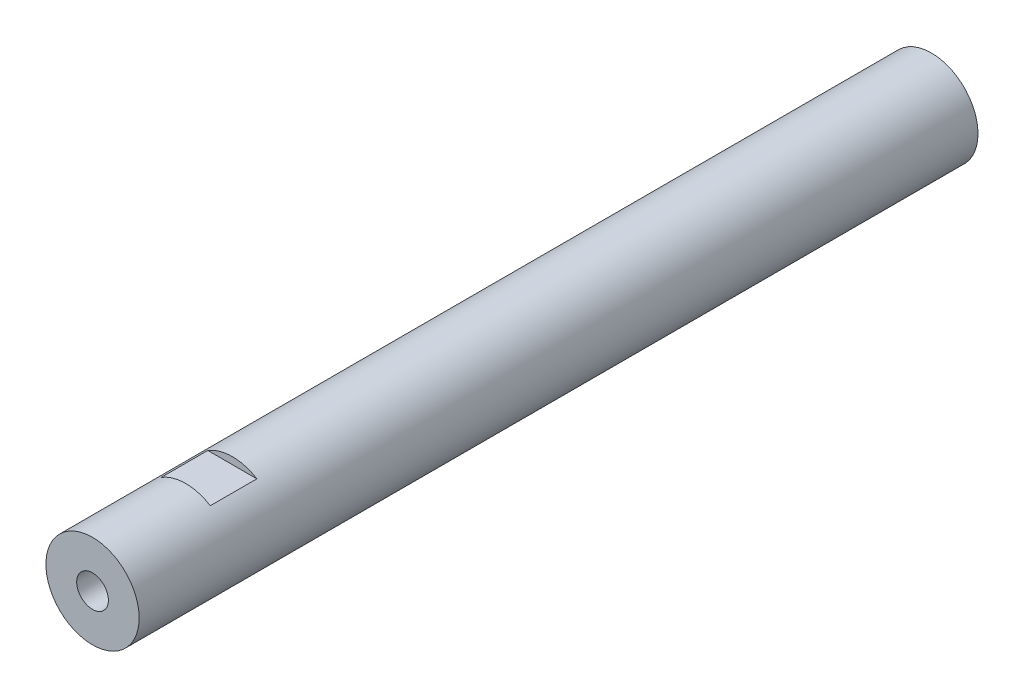
ISO-10303-21;
HEADER;
FILE_DESCRIPTION(('STEP AP214'),'2;1');
FILE_NAME('part.step','',(''),(''),'','','');
FILE_SCHEMA(('AUTOMOTIVE_DESIGN { 1 0 10303 214 1 1 1 1 }'));
ENDSEC;
DATA;
#1=APPLICATION_CONTEXT('core data for automotive mechanical design processes');
#2=APPLICATION_PROTOCOL_DEFINITION('international standard','automotive_design',2000,#1);
#3=PRODUCT_CONTEXT('',#1,'mechanical');
#4=PRODUCT('Part','Part','',(#3));
#5=PRODUCT_RELATED_PRODUCT_CATEGORY('part','',(#4));
#6=PRODUCT_DEFINITION_FORMATION('','',#4);
#7=PRODUCT_DEFINITION_CONTEXT('part definition',#1,'design');
#8=PRODUCT_DEFINITION('design','',#6,#7);
#9=PRODUCT_DEFINITION_SHAPE('','',#8);
#10=(LENGTH_UNIT() NAMED_UNIT(*) SI_UNIT(.MILLI.,.METRE.));
#11=(NAMED_UNIT(*) PLANE_ANGLE_UNIT() SI_UNIT($,.RADIAN.));
#12=(NAMED_UNIT(*) SI_UNIT($,.STERADIAN.) SOLID_ANGLE_UNIT());
#13=UNCERTAINTY_MEASURE_WITH_UNIT(LENGTH_MEASURE(1.E-05),#10,'distance_accuracy_value','');
#14=(GEOMETRIC_REPRESENTATION_CONTEXT(3) GLOBAL_UNCERTAINTY_ASSIGNED_CONTEXT((#13)) GLOBAL_UNIT_ASSIGNED_CONTEXT((#10,
#11,#12)) REPRESENTATION_CONTEXT('',''));
#15=CARTESIAN_POINT('',(0.,0.,0.));
#16=DIRECTION('',(0.,0.,1.));
#17=DIRECTION('',(1.,0.,0.));
#18=AXIS2_PLACEMENT_3D('',#15,#16,#17);
#19=CARTESIAN_POINT('',(0.,0.,90.));
#20=DIRECTION('',(0.,0.,-1.));
#21=DIRECTION('',(-1.,0.,0.));
#22=AXIS2_PLACEMENT_3D('',#19,#20,#21);
#23=CYLINDRICAL_SURFACE('',#22,10.);
#24=CARTESIAN_POINT('',(0.,0.,-90.));
#25=DIRECTION('',(0.,0.,1.));
#26=DIRECTION('',(1.,0.,0.));
#27=AXIS2_PLACEMENT_3D('',#24,#25,#26);
#28=CIRCLE('',#27,10.);
#29=CARTESIAN_POINT('',(10.,0.,-90.));
#30=VERTEX_POINT('',#29);
#31=EDGE_CURVE('E148',#30,#30,#28,.T.);
#32=ORIENTED_EDGE('',*,*,#31,.T.);
#33=EDGE_LOOP('',(#32));
#34=FACE_BOUND('',#33,.T.);
#35=CARTESIAN_POINT('',(0.,0.,90.));
#36=DIRECTION('',(0.,0.,1.));
#37=DIRECTION('',(1.,0.,0.));
#38=AXIS2_PLACEMENT_3D('',#35,#36,#37);
#39=CIRCLE('',#38,10.);
#40=CARTESIAN_POINT('',(10.,0.,90.));
#41=VERTEX_POINT('',#40);
#42=EDGE_CURVE('E149',#41,#41,#39,.T.);
#43=ORIENTED_EDGE('',*,*,#42,.F.);
#44=EDGE_LOOP('',(#43));
#45=FACE_BOUND('',#44,.T.);
#46=DIRECTION('',(0.,0.,1.));
#47=VECTOR('',#46,1.);
#48=CARTESIAN_POINT('',(-5.26782687642637,8.5,60.));
#49=LINE('',#48,#47);
#50=CARTESIAN_POINT('',(-5.26782687642637,8.5,60.));
#51=VERTEX_POINT('',#50);
#52=CARTESIAN_POINT('',(-5.26782687642637,8.5,70.));
#53=VERTEX_POINT('',#52);
#54=EDGE_CURVE('E129',#51,#53,#49,.T.);
#55=ORIENTED_EDGE('',*,*,#54,.F.);
#56=CARTESIAN_POINT('',(0.,0.,60.));
#57=DIRECTION('',(0.,0.,-1.));
#58=DIRECTION('',(-1.,0.,0.));
#59=AXIS2_PLACEMENT_3D('',#56,#57,#58);
#60=CIRCLE('',#59,10.);
#61=CARTESIAN_POINT('',(5.26782687642637,8.5,60.));
#62=VERTEX_POINT('',#61);
#63=EDGE_CURVE('E158',#51,#62,#60,.T.);
#64=ORIENTED_EDGE('',*,*,#63,.T.);
#65=DIRECTION('',(0.,0.,1.));
#66=VECTOR('',#65,1.);
#67=CARTESIAN_POINT('',(5.26782687642637,8.5,60.));
#68=LINE('',#67,#66);
#69=CARTESIAN_POINT('',(5.26782687642637,8.5,70.));
#70=VERTEX_POINT('',#69);
#71=EDGE_CURVE('E133',#62,#70,#68,.T.);
#72=ORIENTED_EDGE('',*,*,#71,.T.);
#73=CARTESIAN_POINT('',(0.,0.,70.));
#74=DIRECTION('',(0.,0.,-1.));
#75=DIRECTION('',(-1.,0.,0.));
#76=AXIS2_PLACEMENT_3D('',#73,#74,#75);
#77=CIRCLE('',#76,10.);
#78=EDGE_CURVE('E153',#53,#70,#77,.T.);
#79=ORIENTED_EDGE('',*,*,#78,.F.);
#80=EDGE_LOOP('',(#55,#64,#72,#79));
#81=FACE_BOUND('',#80,.T.);
#82=CARTESIAN_POINT('',(0.,0.,60.));
#83=DIRECTION('',(0.,0.,1.));
#84=DIRECTION('',(1.,0.,0.));
#85=AXIS2_PLACEMENT_3D('',#82,#83,#84);
#86=CIRCLE('',#85,10.);
#87=CARTESIAN_POINT('',(-5.26782687642637,-8.5,60.));
#88=VERTEX_POINT('',#87);
#89=CARTESIAN_POINT('',(5.26782687642637,-8.5,60.));
#90=VERTEX_POINT('',#89);
#91=EDGE_CURVE('E11',#88,#90,#86,.T.);
#92=ORIENTED_EDGE('',*,*,#91,.F.);
#93=DIRECTION('',(0.,0.,1.));
#94=VECTOR('',#93,1.);
#95=CARTESIAN_POINT('',(-5.26782687642637,-8.5,60.));
#96=LINE('',#95,#94);
#97=CARTESIAN_POINT('',(-5.26782687642637,-8.5,70.));
#98=VERTEX_POINT('',#97);
#99=EDGE_CURVE('E118',#88,#98,#96,.T.);
#100=ORIENTED_EDGE('',*,*,#99,.T.);
#101=CARTESIAN_POINT('',(0.,0.,70.));
#102=DIRECTION('',(0.,0.,1.));
#103=DIRECTION('',(1.,0.,0.));
#104=AXIS2_PLACEMENT_3D('',#101,#102,#103);
#105=CIRCLE('',#104,10.);
#106=CARTESIAN_POINT('',(5.26782687642637,-8.5,70.));
#107=VERTEX_POINT('',#106);
#108=EDGE_CURVE('E50',#98,#107,#105,.T.);
#109=ORIENTED_EDGE('',*,*,#108,.T.);
#110=DIRECTION('',(0.,0.,1.));
#111=VECTOR('',#110,1.);
#112=CARTESIAN_POINT('',(5.26782687642637,-8.5,60.));
#113=LINE('',#112,#111);
#114=EDGE_CURVE('E116',#90,#107,#113,.T.);
#115=ORIENTED_EDGE('',*,*,#114,.F.);
#116=EDGE_LOOP('',(#92,#100,#109,#115));
#117=FACE_BOUND('',#116,.T.);
#118=ADVANCED_FACE('F42',(#34,#45,#81,#117),#23,.T.);
#119=CARTESIAN_POINT('',(0.,0.,90.));
#120=DIRECTION('',(0.,0.,1.));
#121=DIRECTION('',(1.,0.,0.));
#122=AXIS2_PLACEMENT_3D('',#119,#120,#121);
#123=PLANE('',#122);
#124=CARTESIAN_POINT('',(0.,0.,90.));
#125=DIRECTION('',(0.,0.,1.));
#126=DIRECTION('',(1.,0.,0.));
#127=AXIS2_PLACEMENT_3D('',#124,#125,#126);
#128=CIRCLE('',#127,3.39999999999999);
#129=CARTESIAN_POINT('',(3.39999999999999,0.,90.));
#130=VERTEX_POINT('',#129);
#131=EDGE_CURVE('E137',#130,#130,#128,.T.);
#132=ORIENTED_EDGE('',*,*,#131,.F.);
#133=EDGE_LOOP('',(#132));
#134=FACE_BOUND('',#133,.T.);
#135=ORIENTED_EDGE('',*,*,#42,.T.);
#136=EDGE_LOOP('',(#135));
#137=FACE_BOUND('',#136,.T.);
#138=ADVANCED_FACE('F183',(#134,#137),#123,.T.);
#139=CARTESIAN_POINT('',(0.,0.,-90.));
#140=DIRECTION('',(0.,0.,1.));
#141=DIRECTION('',(1.,0.,0.));
#142=AXIS2_PLACEMENT_3D('',#139,#140,#141);
#143=PLANE('',#142);
#144=CARTESIAN_POINT('',(0.,0.,-90.));
#145=DIRECTION('',(0.,0.,-1.));
#146=DIRECTION('',(-1.,0.,0.));
#147=AXIS2_PLACEMENT_3D('',#144,#145,#146);
#148=CIRCLE('',#147,3.39999999999999);
#149=CARTESIAN_POINT('',(-3.39999999999999,0.,-90.));
#150=VERTEX_POINT('',#149);
#151=EDGE_CURVE('E104',#150,#150,#148,.T.);
#152=ORIENTED_EDGE('',*,*,#151,.F.);
#153=EDGE_LOOP('',(#152));
#154=FACE_BOUND('',#153,.T.);
#155=ORIENTED_EDGE('',*,*,#31,.F.);
#156=EDGE_LOOP('',(#155));
#157=FACE_BOUND('',#156,.T.);
#158=ADVANCED_FACE('F188',(#154,#157),#143,.F.);
#159=CARTESIAN_POINT('',(0.,0.,67.75));
#160=DIRECTION('',(0.,0.,1.));
#161=DIRECTION('',(1.,0.,0.));
#162=AXIS2_PLACEMENT_3D('',#159,#160,#161);
#163=CONICAL_SURFACE('',#162,3.39999999999999,1.02974425867665);
#164=CARTESIAN_POINT('',(0.,0.,65.7070738953063));
#165=VERTEX_POINT('',#164);
#166=VERTEX_LOOP('',#165);
#167=FACE_BOUND('',#166,.T.);
#168=CARTESIAN_POINT('',(0.,0.,67.75));
#169=DIRECTION('',(0.,0.,1.));
#170=DIRECTION('',(1.,0.,0.));
#171=AXIS2_PLACEMENT_3D('',#168,#169,#170);
#172=CIRCLE('',#171,3.39999999999999);
#173=CARTESIAN_POINT('',(3.39999999999999,0.,67.75));
#174=VERTEX_POINT('',#173);
#175=EDGE_CURVE('E144',#174,#174,#172,.T.);
#176=ORIENTED_EDGE('',*,*,#175,.T.);
#177=EDGE_LOOP('',(#176));
#178=FACE_BOUND('',#177,.T.);
#179=ADVANCED_FACE('F212',(#167,#178),#163,.F.);
#180=CARTESIAN_POINT('',(0.,0.,90.));
#181=DIRECTION('',(0.,0.,1.));
#182=DIRECTION('',(1.,0.,0.));
#183=AXIS2_PLACEMENT_3D('',#180,#181,#182);
#184=CYLINDRICAL_SURFACE('',#183,3.39999999999999);
#185=ORIENTED_EDGE('',*,*,#175,.F.);
#186=EDGE_LOOP('',(#185));
#187=FACE_BOUND('',#186,.T.);
#188=ORIENTED_EDGE('',*,*,#131,.T.);
#189=EDGE_LOOP('',(#188));
#190=FACE_BOUND('',#189,.T.);
#191=ADVANCED_FACE('F205',(#187,#190),#184,.F.);
#192=CARTESIAN_POINT('',(0.,0.,60.));
#193=DIRECTION('',(0.,0.,-1.));
#194=DIRECTION('',(-1.,0.,0.));
#195=AXIS2_PLACEMENT_3D('',#192,#193,#194);
#196=PLANE('',#195);
#197=DIRECTION('',(1.,0.,0.));
#198=VECTOR('',#197,1.);
#199=CARTESIAN_POINT('',(-5.26782687642637,8.5,60.));
#200=LINE('',#199,#198);
#201=EDGE_CURVE('E125',#51,#62,#200,.T.);
#202=ORIENTED_EDGE('',*,*,#201,.T.);
#203=ORIENTED_EDGE('',*,*,#63,.F.);
#204=EDGE_LOOP('',(#202,#203));
#205=FACE_BOUND('',#204,.T.);
#206=ADVANCED_FACE('F200',(#205),#196,.F.);
#207=CARTESIAN_POINT('',(0.,0.,70.));
#208=DIRECTION('',(0.,0.,-1.));
#209=DIRECTION('',(-1.,0.,0.));
#210=AXIS2_PLACEMENT_3D('',#207,#208,#209);
#211=PLANE('',#210);
#212=DIRECTION('',(1.,0.,0.));
#213=VECTOR('',#212,1.);
#214=CARTESIAN_POINT('',(-5.26782687642637,8.5,70.));
#215=LINE('',#214,#213);
#216=EDGE_CURVE('E122',#53,#70,#215,.T.);
#217=ORIENTED_EDGE('',*,*,#216,.F.);
#218=ORIENTED_EDGE('',*,*,#78,.T.);
#219=EDGE_LOOP('',(#217,#218));
#220=FACE_BOUND('',#219,.T.);
#221=ADVANCED_FACE('F179',(#220),#211,.T.);
#222=CARTESIAN_POINT('',(-5.26782687642637,8.5,60.));
#223=DIRECTION('',(0.,-1.,0.));
#224=DIRECTION('',(0.,0.,-1.));
#225=AXIS2_PLACEMENT_3D('',#222,#223,#224);
#226=PLANE('',#225);
#227=ORIENTED_EDGE('',*,*,#216,.T.);
#228=ORIENTED_EDGE('',*,*,#71,.F.);
#229=ORIENTED_EDGE('',*,*,#201,.F.);
#230=ORIENTED_EDGE('',*,*,#54,.T.);
#231=EDGE_LOOP('',(#227,#228,#229,#230));
#232=FACE_BOUND('',#231,.T.);
#233=ADVANCED_FACE('F172',(#232),#226,.F.);
#234=CARTESIAN_POINT('',(0.,0.,60.));
#235=DIRECTION('',(0.,0.,1.));
#236=DIRECTION('',(1.,0.,0.));
#237=AXIS2_PLACEMENT_3D('',#234,#235,#236);
#238=PLANE('',#237);
#239=DIRECTION('',(-1.,0.,0.));
#240=VECTOR('',#239,1.);
#241=CARTESIAN_POINT('',(-5.26782687642637,-8.5,60.));
#242=LINE('',#241,#240);
#243=EDGE_CURVE('E109',#90,#88,#242,.T.);
#244=ORIENTED_EDGE('',*,*,#243,.T.);
#245=ORIENTED_EDGE('',*,*,#91,.T.);
#246=EDGE_LOOP('',(#244,#245));
#247=FACE_BOUND('',#246,.T.);
#248=ADVANCED_FACE('F170',(#247),#238,.T.);
#249=CARTESIAN_POINT('',(0.,0.,70.));
#250=DIRECTION('',(0.,0.,1.));
#251=DIRECTION('',(1.,0.,0.));
#252=AXIS2_PLACEMENT_3D('',#249,#250,#251);
#253=PLANE('',#252);
#254=DIRECTION('',(-1.,0.,0.));
#255=VECTOR('',#254,1.);
#256=CARTESIAN_POINT('',(-5.26782687642637,-8.5,70.));
#257=LINE('',#256,#255);
#258=EDGE_CURVE('E58',#107,#98,#257,.T.);
#259=ORIENTED_EDGE('',*,*,#258,.F.);
#260=ORIENTED_EDGE('',*,*,#108,.F.);
#261=EDGE_LOOP('',(#259,#260));
#262=FACE_BOUND('',#261,.T.);
#263=ADVANCED_FACE('F166',(#262),#253,.F.);
#264=CARTESIAN_POINT('',(-5.26782687642637,-8.5,60.));
#265=DIRECTION('',(0.,1.,0.));
#266=DIRECTION('',(0.,0.,1.));
#267=AXIS2_PLACEMENT_3D('',#264,#265,#266);
#268=PLANE('',#267);
#269=ORIENTED_EDGE('',*,*,#258,.T.);
#270=ORIENTED_EDGE('',*,*,#99,.F.);
#271=ORIENTED_EDGE('',*,*,#243,.F.);
#272=ORIENTED_EDGE('',*,*,#114,.T.);
#273=EDGE_LOOP('',(#269,#270,#271,#272));
#274=FACE_BOUND('',#273,.T.);
#275=ADVANCED_FACE('F97',(#274),#268,.F.);
#276=CARTESIAN_POINT('',(0.,0.,-67.75));
#277=DIRECTION('',(0.,0.,-1.));
#278=DIRECTION('',(-1.,0.,0.));
#279=AXIS2_PLACEMENT_3D('',#276,#277,#278);
#280=CONICAL_SURFACE('',#279,3.39999999999999,1.02974425867665);
#281=CARTESIAN_POINT('',(0.,0.,-65.7070738953063));
#282=VERTEX_POINT('',#281);
#283=VERTEX_LOOP('',#282);
#284=FACE_BOUND('',#283,.T.);
#285=CARTESIAN_POINT('',(0.,0.,-67.75));
#286=DIRECTION('',(0.,0.,-1.));
#287=DIRECTION('',(-1.,0.,0.));
#288=AXIS2_PLACEMENT_3D('',#285,#286,#287);
#289=CIRCLE('',#288,3.39999999999999);
#290=CARTESIAN_POINT('',(-3.39999999999999,0.,-67.75));
#291=VERTEX_POINT('',#290);
#292=EDGE_CURVE('E101',#291,#291,#289,.T.);
#293=ORIENTED_EDGE('',*,*,#292,.T.);
#294=EDGE_LOOP('',(#293));
#295=FACE_BOUND('',#294,.T.);
#296=ADVANCED_FACE('F93',(#284,#295),#280,.F.);
#297=CARTESIAN_POINT('',(0.,0.,-90.));
#298=DIRECTION('',(0.,0.,-1.));
#299=DIRECTION('',(-1.,0.,0.));
#300=AXIS2_PLACEMENT_3D('',#297,#298,#299);
#301=CYLINDRICAL_SURFACE('',#300,3.39999999999999);
#302=ORIENTED_EDGE('',*,*,#292,.F.);
#303=EDGE_LOOP('',(#302));
#304=FACE_BOUND('',#303,.T.);
#305=ORIENTED_EDGE('',*,*,#151,.T.);
#306=EDGE_LOOP('',(#305));
#307=FACE_BOUND('',#306,.T.);
#308=ADVANCED_FACE('F96',(#304,#307),#301,.F.);
#309=CLOSED_SHELL('',(#118,#138,#158,#179,#191,#206,#221,#233,#248,#263,#275,#296,#308));
#310=MANIFOLD_SOLID_BREP('B2',#309);
#311=ADVANCED_BREP_SHAPE_REPRESENTATION('',(#18,#310),#14);
#312=SHAPE_DEFINITION_REPRESENTATION(#9,#311);
ENDSEC;
END-ISO-10303-21;
